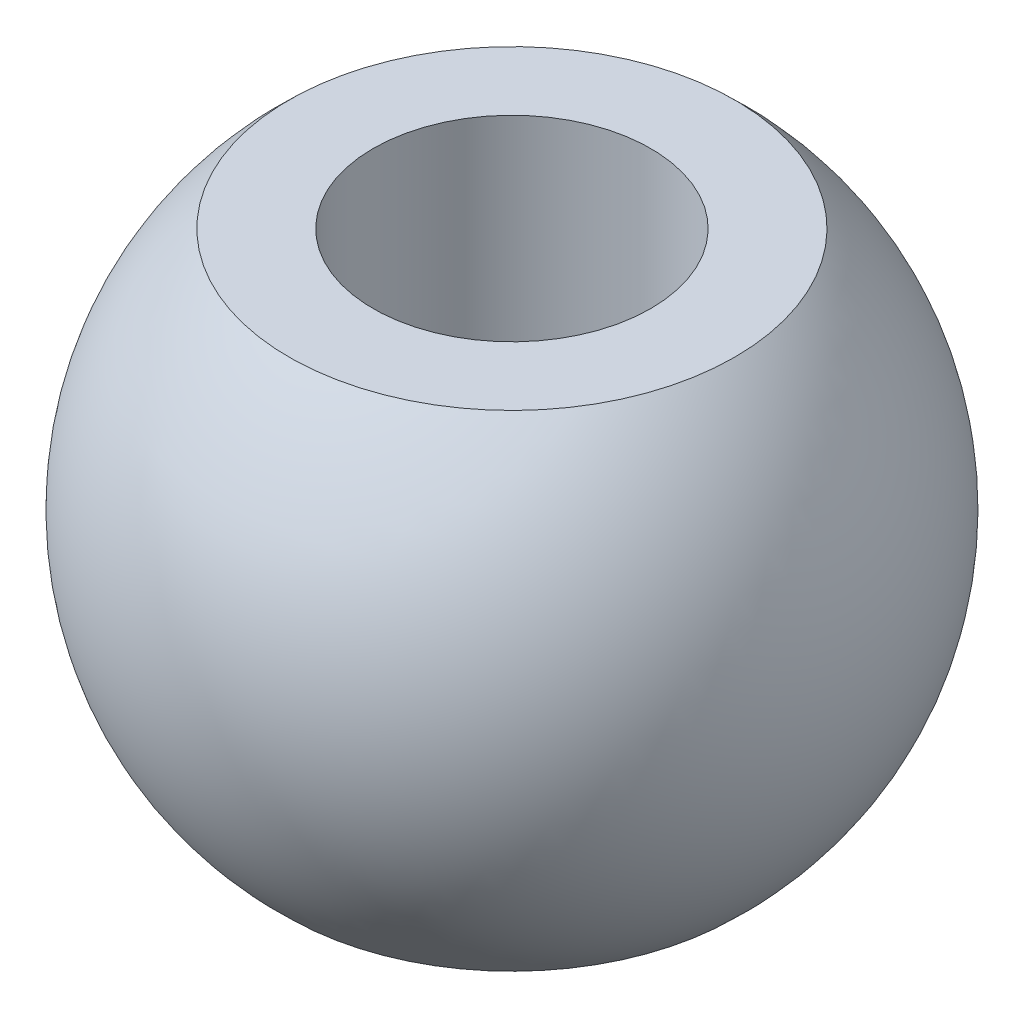
ISO-10303-21;
HEADER;
FILE_DESCRIPTION(('STEP AP214'),'2;1');
FILE_NAME('part.step','',(''),(''),'','','');
FILE_SCHEMA(('AUTOMOTIVE_DESIGN { 1 0 10303 214 1 1 1 1 }'));
ENDSEC;
DATA;
#1=APPLICATION_CONTEXT('core data for automotive mechanical design processes');
#2=APPLICATION_PROTOCOL_DEFINITION('international standard','automotive_design',2000,#1);
#3=PRODUCT_CONTEXT('',#1,'mechanical');
#4=PRODUCT('Part','Part','',(#3));
#5=PRODUCT_RELATED_PRODUCT_CATEGORY('part','',(#4));
#6=PRODUCT_DEFINITION_FORMATION('','',#4);
#7=PRODUCT_DEFINITION_CONTEXT('part definition',#1,'design');
#8=PRODUCT_DEFINITION('design','',#6,#7);
#9=PRODUCT_DEFINITION_SHAPE('','',#8);
#10=(LENGTH_UNIT() NAMED_UNIT(*) SI_UNIT(.MILLI.,.METRE.));
#11=(NAMED_UNIT(*) PLANE_ANGLE_UNIT() SI_UNIT($,.RADIAN.));
#12=(NAMED_UNIT(*) SI_UNIT($,.STERADIAN.) SOLID_ANGLE_UNIT());
#13=UNCERTAINTY_MEASURE_WITH_UNIT(LENGTH_MEASURE(1.E-05),#10,'distance_accuracy_value','');
#14=(GEOMETRIC_REPRESENTATION_CONTEXT(3) GLOBAL_UNCERTAINTY_ASSIGNED_CONTEXT((#13)) GLOBAL_UNIT_ASSIGNED_CONTEXT((#10,
#11,#12)) REPRESENTATION_CONTEXT('',''));
#15=CARTESIAN_POINT('',(0.,0.,0.));
#16=DIRECTION('',(0.,0.,1.));
#17=DIRECTION('',(1.,0.,0.));
#18=AXIS2_PLACEMENT_3D('',#15,#16,#17);
#19=CARTESIAN_POINT('',(2.,-3.5,0.));
#20=DIRECTION('',(0.,1.,0.));
#21=DIRECTION('',(-1.,0.,0.));
#22=AXIS2_PLACEMENT_3D('',#19,#20,#21);
#23=PLANE('',#22);
#24=CARTESIAN_POINT('',(0.,-3.5,0.));
#25=DIRECTION('',(0.,1.,0.));
#26=DIRECTION('',(-1.,0.,0.));
#27=AXIS2_PLACEMENT_3D('',#24,#25,#26);
#28=CIRCLE('',#27,3.21130814466628);
#29=CARTESIAN_POINT('',(3.21130814466628,-3.5,0.));
#30=VERTEX_POINT('',#29);
#31=EDGE_CURVE('E10',#30,#30,#28,.T.);
#32=ORIENTED_EDGE('',*,*,#31,.F.);
#33=EDGE_LOOP('',(#32));
#34=FACE_BOUND('',#33,.T.);
#35=CARTESIAN_POINT('',(0.,-3.5,0.));
#36=DIRECTION('',(0.,1.,0.));
#37=DIRECTION('',(-1.,0.,0.));
#38=AXIS2_PLACEMENT_3D('',#35,#36,#37);
#39=CIRCLE('',#38,2.);
#40=CARTESIAN_POINT('',(-2.,-3.5,0.));
#41=VERTEX_POINT('',#40);
#42=EDGE_CURVE('E46',#41,#41,#39,.T.);
#43=ORIENTED_EDGE('',*,*,#42,.T.);
#44=EDGE_LOOP('',(#43));
#45=FACE_BOUND('',#44,.T.);
#46=ADVANCED_FACE('F32',(#34,#45),#23,.F.);
#47=CARTESIAN_POINT('',(0.,0.,0.));
#48=DIRECTION('',(0.,1.,0.));
#49=DIRECTION('',(1.,0.,0.));
#50=AXIS2_PLACEMENT_3D('',#47,#48,#49);
#51=SPHERICAL_SURFACE('',#50,4.75);
#52=CARTESIAN_POINT('',(0.,3.5,0.));
#53=DIRECTION('',(0.,1.,0.));
#54=DIRECTION('',(-1.,0.,0.));
#55=AXIS2_PLACEMENT_3D('',#52,#53,#54);
#56=CIRCLE('',#55,3.21130814466628);
#57=CARTESIAN_POINT('',(3.21130814466628,3.5,0.));
#58=VERTEX_POINT('',#57);
#59=EDGE_CURVE('E38',#58,#58,#56,.T.);
#60=CARTESIAN_POINT('',(3.21130814466628,3.5,0.));
#61=CARTESIAN_POINT('',(3.27171284706801,3.44458045075335,0.));
#62=CARTESIAN_POINT('',(3.33068001625679,3.38759440702967,0.));
#63=CARTESIAN_POINT('',(3.4455876552553,3.27064833742026,0.));
#64=CARTESIAN_POINT('',(3.50152812506501,3.21068831153452,0.));
#65=CARTESIAN_POINT('',(3.61023073235215,3.08795328439302,0.));
#66=CARTESIAN_POINT('',(3.66299286982957,3.02517828313725,0.));
#67=CARTESIAN_POINT('',(3.76519787079563,2.89698199170249,0.));
#68=CARTESIAN_POINT('',(3.81464073428427,2.83156070152351,0.));
#69=CARTESIAN_POINT('',(3.91007455879507,2.69824703843148,0.));
#70=CARTESIAN_POINT('',(3.95606551981724,2.63035466551844,0.));
#71=CARTESIAN_POINT('',(4.04447231796107,2.49228081890533,0.));
#72=CARTESIAN_POINT('',(4.08688815508272,2.42209934520526,0.));
#73=CARTESIAN_POINT('',(4.16803102340463,2.27963537260281,0.));
#74=CARTESIAN_POINT('',(4.20675805460488,2.20735287370043,0.));
#75=CARTESIAN_POINT('',(4.28041952615721,2.06088056797181,0.));
#76=CARTESIAN_POINT('',(4.31535396650929,1.98669076114558,0.));
#77=CARTESIAN_POINT('',(4.38133663246741,1.83660266542663,0.));
#78=CARTESIAN_POINT('',(4.41238485807344,1.76070437653392,0.));
#79=CARTESIAN_POINT('',(4.47051188638619,1.60740272201098,0.));
#80=CARTESIAN_POINT('',(4.4975906890929,1.52999935638076,0.));
#81=CARTESIAN_POINT('',(4.54770630117375,1.37389498706102,0.));
#82=CARTESIAN_POINT('',(4.57074311054789,1.29519398337149,0.));
#83=CARTESIAN_POINT('',(4.61271299801031,1.13670525429957,0.));
#84=CARTESIAN_POINT('',(4.63164607609858,1.05691752891717,0.));
#85=CARTESIAN_POINT('',(4.66535776089855,0.896469185192627,0.));
#86=CARTESIAN_POINT('',(4.68013636761024,0.815808566850476,0.));
#87=CARTESIAN_POINT('',(4.70549950343049,0.653830605270841,0.));
#88=CARTESIAN_POINT('',(4.71608403253905,0.572513262033356,0.));
#89=CARTESIAN_POINT('',(4.73303064692888,0.409439778729614,0.));
#90=CARTESIAN_POINT('',(4.73939273221015,0.327683638663357,0.));
#91=CARTESIAN_POINT('',(4.74787740874571,0.163951665731399,0.));
#92=CARTESIAN_POINT('',(4.75,0.0819758328656999,0.));
#93=CARTESIAN_POINT('',(4.75,-0.0819758328656993,0.));
#94=CARTESIAN_POINT('',(4.74787740874571,-0.163951665731399,0.));
#95=CARTESIAN_POINT('',(4.73939273221015,-0.327683638663356,0.));
#96=CARTESIAN_POINT('',(4.73303064692888,-0.409439778729614,0.));
#97=CARTESIAN_POINT('',(4.71608403253905,-0.572513262033356,0.));
#98=CARTESIAN_POINT('',(4.70549950343049,-0.65383060527084,0.));
#99=CARTESIAN_POINT('',(4.68013636761024,-0.815808566850476,0.));
#100=CARTESIAN_POINT('',(4.66535776089855,-0.896469185192627,0.));
#101=CARTESIAN_POINT('',(4.63164607609858,-1.05691752891717,0.));
#102=CARTESIAN_POINT('',(4.61271299801031,-1.13670525429957,0.));
#103=CARTESIAN_POINT('',(4.57074311054789,-1.29519398337149,0.));
#104=CARTESIAN_POINT('',(4.54770630117375,-1.37389498706102,0.));
#105=CARTESIAN_POINT('',(4.4975906890929,-1.52999935638076,0.));
#106=CARTESIAN_POINT('',(4.47051188638619,-1.60740272201098,0.));
#107=CARTESIAN_POINT('',(4.41238485807344,-1.76070437653391,0.));
#108=CARTESIAN_POINT('',(4.38133663246741,-1.83660266542663,0.));
#109=CARTESIAN_POINT('',(4.31535396650929,-1.98669076114558,0.));
#110=CARTESIAN_POINT('',(4.28041952615721,-2.06088056797181,0.));
#111=CARTESIAN_POINT('',(4.20675805460488,-2.20735287370043,0.));
#112=CARTESIAN_POINT('',(4.16803102340463,-2.27963537260281,0.));
#113=CARTESIAN_POINT('',(4.08688815508272,-2.42209934520526,0.));
#114=CARTESIAN_POINT('',(4.04447231796107,-2.49228081890533,0.));
#115=CARTESIAN_POINT('',(3.95606551981724,-2.63035466551844,0.));
#116=CARTESIAN_POINT('',(3.91007455879507,-2.69824703843148,0.));
#117=CARTESIAN_POINT('',(3.81464073428427,-2.83156070152351,0.));
#118=CARTESIAN_POINT('',(3.76519787079563,-2.89698199170249,0.));
#119=CARTESIAN_POINT('',(3.66299286982958,-3.02517828313725,0.));
#120=CARTESIAN_POINT('',(3.61023073235215,-3.08795328439302,0.));
#121=CARTESIAN_POINT('',(3.50152812506501,-3.21068831153452,0.));
#122=CARTESIAN_POINT('',(3.4455876552553,-3.27064833742025,0.));
#123=CARTESIAN_POINT('',(3.3306800162568,-3.38759440702967,0.));
#124=CARTESIAN_POINT('',(3.27171284706801,-3.44458045075335,0.));
#125=CARTESIAN_POINT('',(3.21130814466628,-3.5,0.));
#126=B_SPLINE_CURVE_WITH_KNOTS('',3,(#60,#61,#62,#63,#64,#65,#66,#67,#68,#69,#70,#71,#72,#73,
#74,#75,#76,#77,#78,#79,#80,#81,#82,#83,#84,#85,#86,#87,#88,#89,#90,#91,#92,#93,#94,#95,#96,#97,
#98,#99,#100,#101,#102,#103,#104,#105,#106,#107,#108,#109,#110,#111,#112,#113,#114,#115,#116,
#117,#118,#119,#120,#121,#122,#123,#124,#125),.UNSPECIFIED.,.F.,.F.,(4,2,2,2,2,2,2,2,2,2,2,2,2,
2,2,2,2,2,2,2,2,2,2,2,2,2,2,2,2,2,2,2,4),(0.,0.245900041601566,0.491800083203131,
0.737700124804697,0.983600166406263,1.22950020800783,1.47540024960939,1.72130029121096,
1.96720033281253,2.21310037441409,2.45900041601566,2.70490045761722,2.95080049921879,
3.19670054082036,3.44260058242192,3.68850062402349,3.93440066562505,4.18030070722662,
4.42620074882818,4.67210079042975,4.91800083203132,5.16390087363288,5.40980091523445,
5.65570095683601,5.90160099843758,6.14750104003915,6.39340108164071,6.63930112324228,
6.88520116484384,7.13110120644541,7.37700124804697,7.62290128964854,7.86880133125011),.UNSPECIFIED.);
#127=EDGE_CURVE('BSEAM61',#58,#30,#126,.T.);
#128=ORIENTED_EDGE('',*,*,#59,.F.);
#129=ORIENTED_EDGE('',*,*,#31,.T.);
#130=ORIENTED_EDGE('',*,*,#127,.T.);
#131=ORIENTED_EDGE('',*,*,#127,.F.);
#132=EDGE_LOOP('',(#128,#130,#129,#131));
#133=FACE_BOUND('',#132,.T.);
#134=ADVANCED_FACE('F61',(#133),#51,.T.);
#135=CARTESIAN_POINT('',(2.,3.5,0.));
#136=DIRECTION('',(0.,-1.,0.));
#137=DIRECTION('',(1.,0.,0.));
#138=AXIS2_PLACEMENT_3D('',#135,#136,#137);
#139=PLANE('',#138);
#140=CARTESIAN_POINT('',(0.,3.5,0.));
#141=DIRECTION('',(0.,1.,0.));
#142=DIRECTION('',(-1.,0.,0.));
#143=AXIS2_PLACEMENT_3D('',#140,#141,#142);
#144=CIRCLE('',#143,2.);
#145=CARTESIAN_POINT('',(-2.,3.5,0.));
#146=VERTEX_POINT('',#145);
#147=EDGE_CURVE('E42',#146,#146,#144,.T.);
#148=ORIENTED_EDGE('',*,*,#147,.F.);
#149=EDGE_LOOP('',(#148));
#150=FACE_BOUND('',#149,.T.);
#151=ORIENTED_EDGE('',*,*,#59,.T.);
#152=EDGE_LOOP('',(#151));
#153=FACE_BOUND('',#152,.T.);
#154=ADVANCED_FACE('F56',(#150,#153),#139,.F.);
#155=CARTESIAN_POINT('',(0.,3.5,0.));
#156=DIRECTION('',(0.,1.,0.));
#157=DIRECTION('',(-1.,0.,0.));
#158=AXIS2_PLACEMENT_3D('',#155,#156,#157);
#159=CYLINDRICAL_SURFACE('',#158,2.);
#160=ORIENTED_EDGE('',*,*,#42,.F.);
#161=EDGE_LOOP('',(#160));
#162=FACE_BOUND('',#161,.T.);
#163=ORIENTED_EDGE('',*,*,#147,.T.);
#164=EDGE_LOOP('',(#163));
#165=FACE_BOUND('',#164,.T.);
#166=ADVANCED_FACE('F53',(#162,#165),#159,.F.);
#167=CLOSED_SHELL('',(#46,#134,#154,#166));
#168=MANIFOLD_SOLID_BREP('B2',#167);
#169=ADVANCED_BREP_SHAPE_REPRESENTATION('',(#18,#168),#14);
#170=SHAPE_DEFINITION_REPRESENTATION(#9,#169);
ENDSEC;
END-ISO-10303-21;
